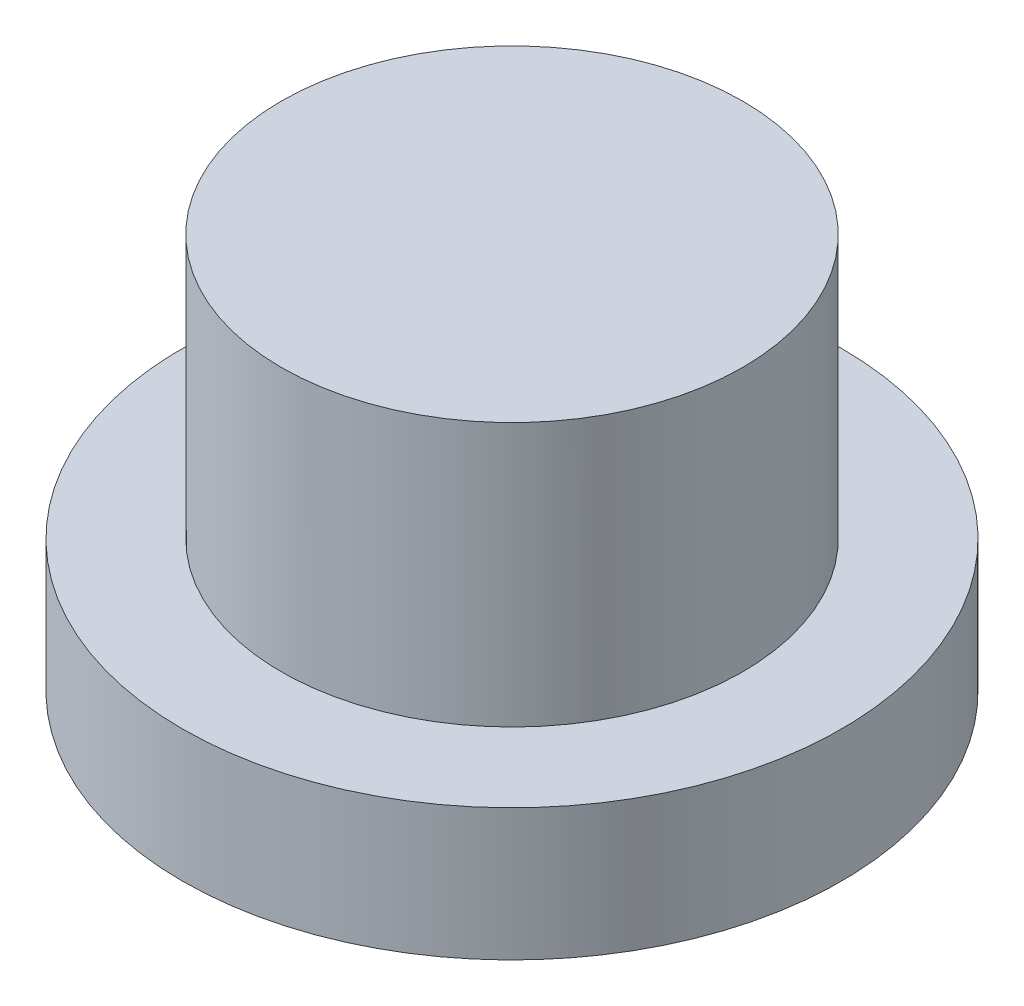
ISO-10303-21;
HEADER;
FILE_DESCRIPTION(('STEP AP214'),'2;1');
FILE_NAME('part.step','',(''),(''),'','','');
FILE_SCHEMA(('AUTOMOTIVE_DESIGN { 1 0 10303 214 1 1 1 1 }'));
ENDSEC;
DATA;
#1=APPLICATION_CONTEXT('core data for automotive mechanical design processes');
#2=APPLICATION_PROTOCOL_DEFINITION('international standard','automotive_design',2000,#1);
#3=PRODUCT_CONTEXT('',#1,'mechanical');
#4=PRODUCT('Part','Part','',(#3));
#5=PRODUCT_RELATED_PRODUCT_CATEGORY('part','',(#4));
#6=PRODUCT_DEFINITION_FORMATION('','',#4);
#7=PRODUCT_DEFINITION_CONTEXT('part definition',#1,'design');
#8=PRODUCT_DEFINITION('design','',#6,#7);
#9=PRODUCT_DEFINITION_SHAPE('','',#8);
#10=(LENGTH_UNIT() NAMED_UNIT(*) SI_UNIT(.MILLI.,.METRE.));
#11=(NAMED_UNIT(*) PLANE_ANGLE_UNIT() SI_UNIT($,.RADIAN.));
#12=(NAMED_UNIT(*) SI_UNIT($,.STERADIAN.) SOLID_ANGLE_UNIT());
#13=UNCERTAINTY_MEASURE_WITH_UNIT(LENGTH_MEASURE(1.E-05),#10,'distance_accuracy_value','');
#14=(GEOMETRIC_REPRESENTATION_CONTEXT(3) GLOBAL_UNCERTAINTY_ASSIGNED_CONTEXT((#13)) GLOBAL_UNIT_ASSIGNED_CONTEXT((#10,
#11,#12)) REPRESENTATION_CONTEXT('',''));
#15=CARTESIAN_POINT('',(0.,0.,0.));
#16=DIRECTION('',(0.,0.,1.));
#17=DIRECTION('',(1.,0.,0.));
#18=AXIS2_PLACEMENT_3D('',#15,#16,#17);
#19=CARTESIAN_POINT('',(0.,0.,0.));
#20=DIRECTION('',(0.,1.,0.));
#21=DIRECTION('',(0.,0.,1.));
#22=AXIS2_PLACEMENT_3D('',#19,#20,#21);
#23=PLANE('',#22);
#24=CARTESIAN_POINT('',(0.,0.,0.));
#25=DIRECTION('',(0.,1.,0.));
#26=DIRECTION('',(0.,0.,1.));
#27=AXIS2_PLACEMENT_3D('',#24,#25,#26);
#28=CIRCLE('',#27,2.55);
#29=CARTESIAN_POINT('',(0.,0.,2.55));
#30=VERTEX_POINT('',#29);
#31=EDGE_CURVE('E42',#30,#30,#28,.T.);
#32=ORIENTED_EDGE('',*,*,#31,.T.);
#33=EDGE_LOOP('',(#32));
#34=FACE_BOUND('',#33,.T.);
#35=CARTESIAN_POINT('',(0.,0.,0.));
#36=DIRECTION('',(0.,-1.,0.));
#37=DIRECTION('',(0.,0.,-1.));
#38=AXIS2_PLACEMENT_3D('',#35,#36,#37);
#39=CIRCLE('',#38,5.);
#40=CARTESIAN_POINT('',(0.,0.,-5.));
#41=VERTEX_POINT('',#40);
#42=EDGE_CURVE('E56',#41,#41,#39,.T.);
#43=ORIENTED_EDGE('',*,*,#42,.T.);
#44=EDGE_LOOP('',(#43));
#45=FACE_BOUND('',#44,.T.);
#46=ADVANCED_FACE('F35',(#34,#45),#23,.F.);
#47=CARTESIAN_POINT('',(0.,4.,0.));
#48=DIRECTION('',(0.,-1.,0.));
#49=DIRECTION('',(0.,0.,-1.));
#50=AXIS2_PLACEMENT_3D('',#47,#48,#49);
#51=CYLINDRICAL_SURFACE('',#50,2.55);
#52=CARTESIAN_POINT('',(0.,4.,0.));
#53=DIRECTION('',(0.,1.,0.));
#54=DIRECTION('',(0.,0.,1.));
#55=AXIS2_PLACEMENT_3D('',#52,#53,#54);
#56=CIRCLE('',#55,2.55);
#57=CARTESIAN_POINT('',(0.,4.,2.55));
#58=VERTEX_POINT('',#57);
#59=EDGE_CURVE('E46',#58,#58,#56,.T.);
#60=ORIENTED_EDGE('',*,*,#59,.T.);
#61=EDGE_LOOP('',(#60));
#62=FACE_BOUND('',#61,.T.);
#63=ORIENTED_EDGE('',*,*,#31,.F.);
#64=EDGE_LOOP('',(#63));
#65=FACE_BOUND('',#64,.T.);
#66=ADVANCED_FACE('F78',(#62,#65),#51,.F.);
#67=CARTESIAN_POINT('',(0.,4.,0.));
#68=DIRECTION('',(0.,1.,0.));
#69=DIRECTION('',(0.,0.,1.));
#70=AXIS2_PLACEMENT_3D('',#67,#68,#69);
#71=PLANE('',#70);
#72=ORIENTED_EDGE('',*,*,#59,.F.);
#73=EDGE_LOOP('',(#72));
#74=FACE_BOUND('',#73,.T.);
#75=ADVANCED_FACE('F75',(#74),#71,.F.);
#76=CARTESIAN_POINT('',(0.,2.,0.));
#77=DIRECTION('',(0.,-1.,0.));
#78=DIRECTION('',(0.,0.,-1.));
#79=AXIS2_PLACEMENT_3D('',#76,#77,#78);
#80=CYLINDRICAL_SURFACE('',#79,5.);
#81=CARTESIAN_POINT('',(0.,2.,0.));
#82=DIRECTION('',(0.,-1.,0.));
#83=DIRECTION('',(0.,0.,-1.));
#84=AXIS2_PLACEMENT_3D('',#81,#82,#83);
#85=CIRCLE('',#84,5.);
#86=CARTESIAN_POINT('',(0.,2.,-5.));
#87=VERTEX_POINT('',#86);
#88=EDGE_CURVE('E55',#87,#87,#85,.T.);
#89=ORIENTED_EDGE('',*,*,#88,.T.);
#90=EDGE_LOOP('',(#89));
#91=FACE_BOUND('',#90,.T.);
#92=ORIENTED_EDGE('',*,*,#42,.F.);
#93=EDGE_LOOP('',(#92));
#94=FACE_BOUND('',#93,.T.);
#95=ADVANCED_FACE('F62',(#91,#94),#80,.T.);
#96=CARTESIAN_POINT('',(0.,2.,0.));
#97=DIRECTION('',(0.,-1.,0.));
#98=DIRECTION('',(0.,0.,-1.));
#99=AXIS2_PLACEMENT_3D('',#96,#97,#98);
#100=PLANE('',#99);
#101=CARTESIAN_POINT('',(0.,2.,0.));
#102=DIRECTION('',(0.,-1.,0.));
#103=DIRECTION('',(0.,0.,-1.));
#104=AXIS2_PLACEMENT_3D('',#101,#102,#103);
#105=CIRCLE('',#104,3.5);
#106=CARTESIAN_POINT('',(0.,2.,-3.5));
#107=VERTEX_POINT('',#106);
#108=EDGE_CURVE('E10',#107,#107,#105,.T.);
#109=ORIENTED_EDGE('',*,*,#108,.T.);
#110=EDGE_LOOP('',(#109));
#111=FACE_BOUND('',#110,.T.);
#112=ORIENTED_EDGE('',*,*,#88,.F.);
#113=EDGE_LOOP('',(#112));
#114=FACE_BOUND('',#113,.T.);
#115=ADVANCED_FACE('F65',(#111,#114),#100,.F.);
#116=CARTESIAN_POINT('',(0.,6.,0.));
#117=DIRECTION('',(0.,1.,0.));
#118=DIRECTION('',(0.,0.,1.));
#119=AXIS2_PLACEMENT_3D('',#116,#117,#118);
#120=PLANE('',#119);
#121=CARTESIAN_POINT('',(0.,6.,0.));
#122=DIRECTION('',(0.,1.,0.));
#123=DIRECTION('',(0.,0.,1.));
#124=AXIS2_PLACEMENT_3D('',#121,#122,#123);
#125=CIRCLE('',#124,3.5);
#126=CARTESIAN_POINT('',(0.,6.,3.5));
#127=VERTEX_POINT('',#126);
#128=EDGE_CURVE('E50',#127,#127,#125,.T.);
#129=ORIENTED_EDGE('',*,*,#128,.T.);
#130=EDGE_LOOP('',(#129));
#131=FACE_BOUND('',#130,.T.);
#132=ADVANCED_FACE('F67',(#131),#120,.T.);
#133=CARTESIAN_POINT('',(0.,4.,0.));
#134=DIRECTION('',(0.,-1.,0.));
#135=DIRECTION('',(0.,0.,-1.));
#136=AXIS2_PLACEMENT_3D('',#133,#134,#135);
#137=CYLINDRICAL_SURFACE('',#136,3.5);
#138=ORIENTED_EDGE('',*,*,#128,.F.);
#139=EDGE_LOOP('',(#138));
#140=FACE_BOUND('',#139,.T.);
#141=ORIENTED_EDGE('',*,*,#108,.F.);
#142=EDGE_LOOP('',(#141));
#143=FACE_BOUND('',#142,.T.);
#144=ADVANCED_FACE('F37',(#140,#143),#137,.T.);
#145=CLOSED_SHELL('',(#46,#66,#75,#95,#115,#132,#144));
#146=MANIFOLD_SOLID_BREP('B2',#145);
#147=ADVANCED_BREP_SHAPE_REPRESENTATION('',(#18,#146),#14);
#148=SHAPE_DEFINITION_REPRESENTATION(#9,#147);
ENDSEC;
END-ISO-10303-21;
